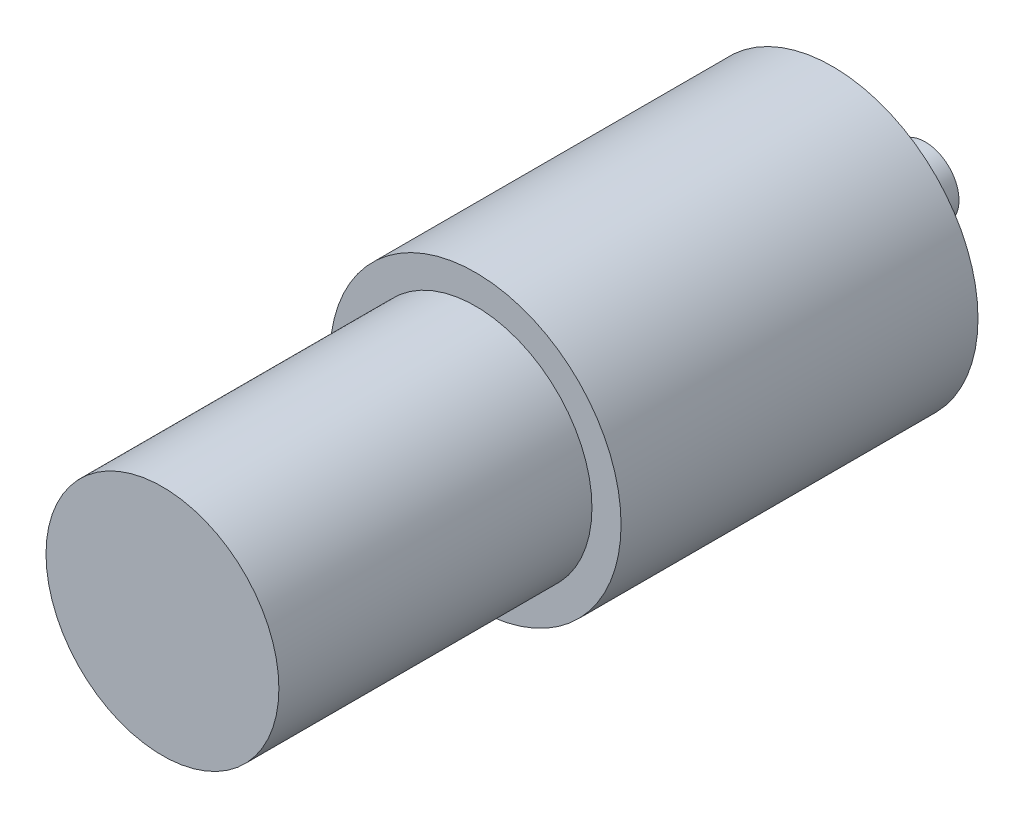
ISO-10303-21;
HEADER;
FILE_DESCRIPTION(('STEP AP214'),'2;1');
FILE_NAME('part.step','',(''),(''),'','','');
FILE_SCHEMA(('AUTOMOTIVE_DESIGN { 1 0 10303 214 1 1 1 1 }'));
ENDSEC;
DATA;
#1=APPLICATION_CONTEXT('core data for automotive mechanical design processes');
#2=APPLICATION_PROTOCOL_DEFINITION('international standard','automotive_design',2000,#1);
#3=PRODUCT_CONTEXT('',#1,'mechanical');
#4=PRODUCT('Part','Part','',(#3));
#5=PRODUCT_RELATED_PRODUCT_CATEGORY('part','',(#4));
#6=PRODUCT_DEFINITION_FORMATION('','',#4);
#7=PRODUCT_DEFINITION_CONTEXT('part definition',#1,'design');
#8=PRODUCT_DEFINITION('design','',#6,#7);
#9=PRODUCT_DEFINITION_SHAPE('','',#8);
#10=(LENGTH_UNIT() NAMED_UNIT(*) SI_UNIT(.MILLI.,.METRE.));
#11=(NAMED_UNIT(*) PLANE_ANGLE_UNIT() SI_UNIT($,.RADIAN.));
#12=(NAMED_UNIT(*) SI_UNIT($,.STERADIAN.) SOLID_ANGLE_UNIT());
#13=UNCERTAINTY_MEASURE_WITH_UNIT(LENGTH_MEASURE(1.E-05),#10,'distance_accuracy_value','');
#14=(GEOMETRIC_REPRESENTATION_CONTEXT(3) GLOBAL_UNCERTAINTY_ASSIGNED_CONTEXT((#13)) GLOBAL_UNIT_ASSIGNED_CONTEXT((#10,
#11,#12)) REPRESENTATION_CONTEXT('',''));
#15=CARTESIAN_POINT('',(0.,0.,0.));
#16=DIRECTION('',(0.,0.,1.));
#17=DIRECTION('',(1.,0.,0.));
#18=AXIS2_PLACEMENT_3D('',#15,#16,#17);
#19=CARTESIAN_POINT('',(0.,0.,42.3));
#20=DIRECTION('',(0.,0.,-1.));
#21=DIRECTION('',(-1.,0.,0.));
#22=AXIS2_PLACEMENT_3D('',#19,#20,#21);
#23=CYLINDRICAL_SURFACE('',#22,17.25);
#24=CARTESIAN_POINT('',(0.,0.,42.3));
#25=DIRECTION('',(0.,0.,1.));
#26=DIRECTION('',(1.,0.,0.));
#27=AXIS2_PLACEMENT_3D('',#24,#25,#26);
#28=CIRCLE('',#27,17.25);
#29=CARTESIAN_POINT('',(17.25,0.,42.3));
#30=VERTEX_POINT('',#29);
#31=EDGE_CURVE('E46',#30,#30,#28,.T.);
#32=ORIENTED_EDGE('',*,*,#31,.F.);
#33=EDGE_LOOP('',(#32));
#34=FACE_BOUND('',#33,.T.);
#35=CARTESIAN_POINT('',(0.,0.,0.));
#36=DIRECTION('',(0.,0.,1.));
#37=DIRECTION('',(1.,0.,0.));
#38=AXIS2_PLACEMENT_3D('',#35,#36,#37);
#39=CIRCLE('',#38,17.25);
#40=CARTESIAN_POINT('',(17.25,0.,0.));
#41=VERTEX_POINT('',#40);
#42=EDGE_CURVE('E37',#41,#41,#39,.T.);
#43=ORIENTED_EDGE('',*,*,#42,.T.);
#44=EDGE_LOOP('',(#43));
#45=FACE_BOUND('',#44,.T.);
#46=ADVANCED_FACE('F34',(#34,#45),#23,.T.);
#47=CARTESIAN_POINT('',(0.,0.,42.3));
#48=DIRECTION('',(0.,0.,1.));
#49=DIRECTION('',(1.,0.,0.));
#50=AXIS2_PLACEMENT_3D('',#47,#48,#49);
#51=PLANE('',#50);
#52=CARTESIAN_POINT('',(0.,0.,42.3));
#53=DIRECTION('',(0.,0.,1.));
#54=DIRECTION('',(1.,0.,0.));
#55=AXIS2_PLACEMENT_3D('',#52,#53,#54);
#56=CIRCLE('',#55,13.8);
#57=CARTESIAN_POINT('',(13.8,0.,42.3));
#58=VERTEX_POINT('',#57);
#59=EDGE_CURVE('E41',#58,#58,#56,.T.);
#60=ORIENTED_EDGE('',*,*,#59,.F.);
#61=EDGE_LOOP('',(#60));
#62=FACE_BOUND('',#61,.T.);
#63=ORIENTED_EDGE('',*,*,#31,.T.);
#64=EDGE_LOOP('',(#63));
#65=FACE_BOUND('',#64,.T.);
#66=ADVANCED_FACE('F63',(#62,#65),#51,.T.);
#67=CARTESIAN_POINT('',(0.,0.,0.));
#68=DIRECTION('',(0.,0.,1.));
#69=DIRECTION('',(1.,0.,0.));
#70=AXIS2_PLACEMENT_3D('',#67,#68,#69);
#71=PLANE('',#70);
#72=CARTESIAN_POINT('',(0.,0.,0.));
#73=DIRECTION('',(0.,0.,-1.));
#74=DIRECTION('',(-1.,0.,0.));
#75=AXIS2_PLACEMENT_3D('',#72,#73,#74);
#76=CIRCLE('',#75,4.);
#77=CARTESIAN_POINT('',(-4.,0.,0.));
#78=VERTEX_POINT('',#77);
#79=EDGE_CURVE('E10',#78,#78,#76,.T.);
#80=ORIENTED_EDGE('',*,*,#79,.F.);
#81=EDGE_LOOP('',(#80));
#82=FACE_BOUND('',#81,.T.);
#83=ORIENTED_EDGE('',*,*,#42,.F.);
#84=EDGE_LOOP('',(#83));
#85=FACE_BOUND('',#84,.T.);
#86=ADVANCED_FACE('F60',(#82,#85),#71,.F.);
#87=CARTESIAN_POINT('',(0.,0.,79.4));
#88=DIRECTION('',(0.,0.,-1.));
#89=DIRECTION('',(-1.,0.,0.));
#90=AXIS2_PLACEMENT_3D('',#87,#88,#89);
#91=CYLINDRICAL_SURFACE('',#90,13.8);
#92=CARTESIAN_POINT('',(0.,0.,79.4));
#93=DIRECTION('',(0.,0.,1.));
#94=DIRECTION('',(1.,0.,0.));
#95=AXIS2_PLACEMENT_3D('',#92,#93,#94);
#96=CIRCLE('',#95,13.8);
#97=CARTESIAN_POINT('',(13.8,0.,79.4));
#98=VERTEX_POINT('',#97);
#99=EDGE_CURVE('E51',#98,#98,#96,.T.);
#100=ORIENTED_EDGE('',*,*,#99,.F.);
#101=EDGE_LOOP('',(#100));
#102=FACE_BOUND('',#101,.T.);
#103=ORIENTED_EDGE('',*,*,#59,.T.);
#104=EDGE_LOOP('',(#103));
#105=FACE_BOUND('',#104,.T.);
#106=ADVANCED_FACE('F62',(#102,#105),#91,.T.);
#107=CARTESIAN_POINT('',(0.,0.,79.4));
#108=DIRECTION('',(0.,0.,1.));
#109=DIRECTION('',(1.,0.,0.));
#110=AXIS2_PLACEMENT_3D('',#107,#108,#109);
#111=PLANE('',#110);
#112=ORIENTED_EDGE('',*,*,#99,.T.);
#113=EDGE_LOOP('',(#112));
#114=FACE_BOUND('',#113,.T.);
#115=ADVANCED_FACE('F69',(#114),#111,.T.);
#116=CARTESIAN_POINT('',(0.,0.,-11.));
#117=DIRECTION('',(0.,0.,1.));
#118=DIRECTION('',(1.,0.,0.));
#119=AXIS2_PLACEMENT_3D('',#116,#117,#118);
#120=CYLINDRICAL_SURFACE('',#119,4.);
#121=CARTESIAN_POINT('',(0.,0.,-11.));
#122=DIRECTION('',(0.,0.,-1.));
#123=DIRECTION('',(-1.,0.,0.));
#124=AXIS2_PLACEMENT_3D('',#121,#122,#123);
#125=CIRCLE('',#124,4.);
#126=CARTESIAN_POINT('',(-4.,0.,-11.));
#127=VERTEX_POINT('',#126);
#128=EDGE_CURVE('E50',#127,#127,#125,.T.);
#129=ORIENTED_EDGE('',*,*,#128,.F.);
#130=EDGE_LOOP('',(#129));
#131=FACE_BOUND('',#130,.T.);
#132=ORIENTED_EDGE('',*,*,#79,.T.);
#133=EDGE_LOOP('',(#132));
#134=FACE_BOUND('',#133,.T.);
#135=ADVANCED_FACE('F99',(#131,#134),#120,.T.);
#136=CARTESIAN_POINT('',(0.,0.,-11.));
#137=DIRECTION('',(0.,0.,-1.));
#138=DIRECTION('',(-1.,0.,0.));
#139=AXIS2_PLACEMENT_3D('',#136,#137,#138);
#140=PLANE('',#139);
#141=ORIENTED_EDGE('',*,*,#128,.T.);
#142=EDGE_LOOP('',(#141));
#143=FACE_BOUND('',#142,.T.);
#144=ADVANCED_FACE('F115',(#143),#140,.T.);
#145=CLOSED_SHELL('',(#46,#66,#86,#106,#115,#135,#144));
#146=MANIFOLD_SOLID_BREP('B2',#145);
#147=ADVANCED_BREP_SHAPE_REPRESENTATION('',(#18,#146),#14);
#148=SHAPE_DEFINITION_REPRESENTATION(#9,#147);
ENDSEC;
END-ISO-10303-21;
